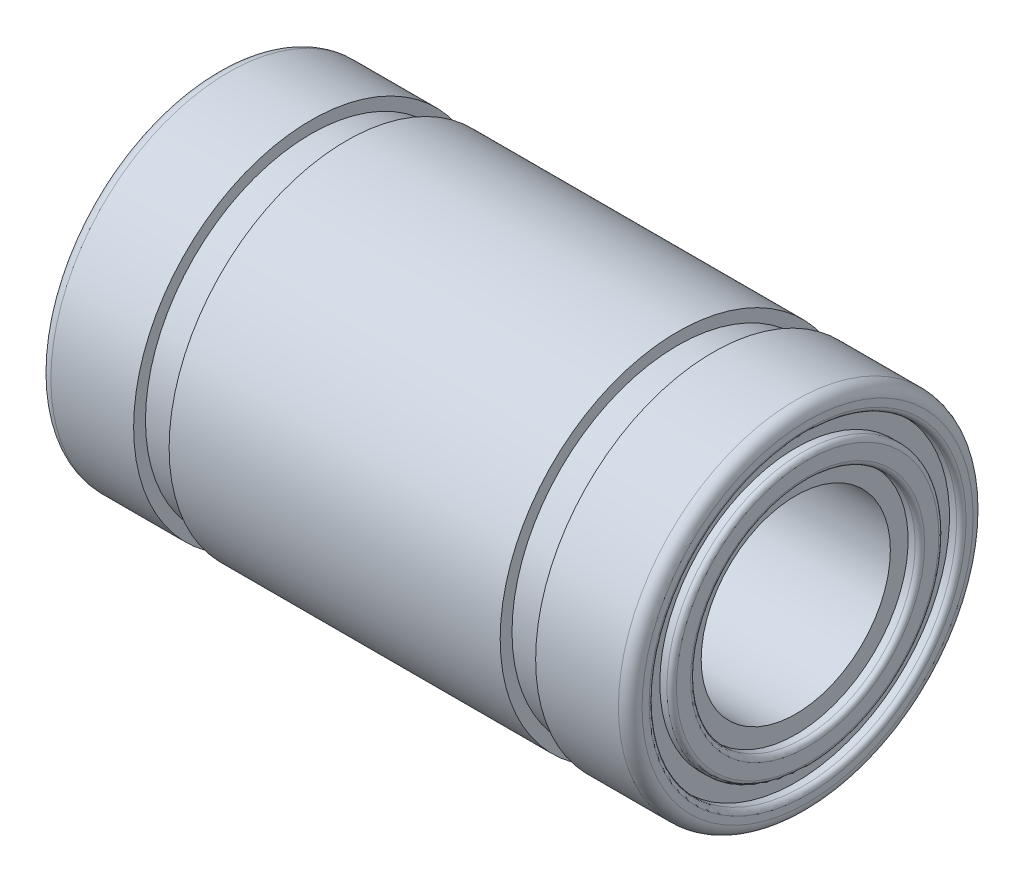
ISO-10303-21;
HEADER;
FILE_DESCRIPTION(('STEP AP214'),'2;1');
FILE_NAME('part.step','',(''),(''),'','','');
FILE_SCHEMA(('AUTOMOTIVE_DESIGN { 1 0 10303 214 1 1 1 1 }'));
ENDSEC;
DATA;
#1=APPLICATION_CONTEXT('core data for automotive mechanical design processes');
#2=APPLICATION_PROTOCOL_DEFINITION('international standard','automotive_design',2000,#1);
#3=PRODUCT_CONTEXT('',#1,'mechanical');
#4=PRODUCT('Part','Part','',(#3));
#5=PRODUCT_RELATED_PRODUCT_CATEGORY('part','',(#4));
#6=PRODUCT_DEFINITION_FORMATION('','',#4);
#7=PRODUCT_DEFINITION_CONTEXT('part definition',#1,'design');
#8=PRODUCT_DEFINITION('design','',#6,#7);
#9=PRODUCT_DEFINITION_SHAPE('','',#8);
#10=(LENGTH_UNIT() NAMED_UNIT(*) SI_UNIT(.MILLI.,.METRE.));
#11=(NAMED_UNIT(*) PLANE_ANGLE_UNIT() SI_UNIT($,.RADIAN.));
#12=(NAMED_UNIT(*) SI_UNIT($,.STERADIAN.) SOLID_ANGLE_UNIT());
#13=UNCERTAINTY_MEASURE_WITH_UNIT(LENGTH_MEASURE(1.E-05),#10,'distance_accuracy_value','');
#14=(GEOMETRIC_REPRESENTATION_CONTEXT(3) GLOBAL_UNCERTAINTY_ASSIGNED_CONTEXT((#13)) GLOBAL_UNIT_ASSIGNED_CONTEXT((#10,
#11,#12)) REPRESENTATION_CONTEXT('',''));
#15=CARTESIAN_POINT('',(0.,0.,0.));
#16=DIRECTION('',(0.,0.,1.));
#17=DIRECTION('',(1.,0.,0.));
#18=AXIS2_PLACEMENT_3D('',#15,#16,#17);
#19=CARTESIAN_POINT('',(24.5,4.75,0.));
#20=DIRECTION('',(-1.,0.,0.));
#21=DIRECTION('',(0.,0.,1.));
#22=AXIS2_PLACEMENT_3D('',#19,#20,#21);
#23=PLANE('',#22);
#24=CARTESIAN_POINT('',(24.5,0.,0.));
#25=DIRECTION('',(-1.,0.,0.));
#26=DIRECTION('',(0.,0.,1.));
#27=AXIS2_PLACEMENT_3D('',#24,#25,#26);
#28=CIRCLE('',#27,4.75);
#29=CARTESIAN_POINT('',(24.5,0.,4.75));
#30=VERTEX_POINT('',#29);
#31=EDGE_CURVE('E87',#30,#30,#28,.T.);
#32=ORIENTED_EDGE('',*,*,#31,.F.);
#33=EDGE_LOOP('',(#32));
#34=FACE_BOUND('',#33,.T.);
#35=CARTESIAN_POINT('',(24.5,0.,0.));
#36=DIRECTION('',(-1.,0.,0.));
#37=DIRECTION('',(0.,0.,1.));
#38=AXIS2_PLACEMENT_3D('',#35,#36,#37);
#39=CIRCLE('',#38,4.);
#40=CARTESIAN_POINT('',(24.5,0.,4.));
#41=VERTEX_POINT('',#40);
#42=EDGE_CURVE('E129',#41,#41,#39,.T.);
#43=ORIENTED_EDGE('',*,*,#42,.T.);
#44=EDGE_LOOP('',(#43));
#45=FACE_BOUND('',#44,.T.);
#46=ADVANCED_FACE('F31',(#34,#45),#23,.F.);
#47=CARTESIAN_POINT('',(0.,0.,0.));
#48=DIRECTION('',(-1.,0.,0.));
#49=DIRECTION('',(0.,0.,1.));
#50=AXIS2_PLACEMENT_3D('',#47,#48,#49);
#51=CYLINDRICAL_SURFACE('',#50,4.75);
#52=CARTESIAN_POINT('',(24.8,0.,0.));
#53=DIRECTION('',(-1.,0.,0.));
#54=DIRECTION('',(0.,0.,1.));
#55=AXIS2_PLACEMENT_3D('',#52,#53,#54);
#56=CIRCLE('',#55,4.75);
#57=CARTESIAN_POINT('',(24.8,0.,4.75));
#58=VERTEX_POINT('',#57);
#59=EDGE_CURVE('E54',#58,#58,#56,.F.);
#60=ORIENTED_EDGE('',*,*,#59,.T.);
#61=EDGE_LOOP('',(#60));
#62=FACE_BOUND('',#61,.T.);
#63=ORIENTED_EDGE('',*,*,#31,.T.);
#64=EDGE_LOOP('',(#63));
#65=FACE_BOUND('',#64,.T.);
#66=ADVANCED_FACE('F147',(#62,#65),#51,.F.);
#67=CARTESIAN_POINT('',(25.,4.75,0.));
#68=DIRECTION('',(-1.,0.,0.));
#69=DIRECTION('',(0.,0.,1.));
#70=AXIS2_PLACEMENT_3D('',#67,#68,#69);
#71=PLANE('',#70);
#72=CARTESIAN_POINT('',(25.,0.,0.));
#73=DIRECTION('',(-1.,0.,0.));
#74=DIRECTION('',(0.,0.,1.));
#75=AXIS2_PLACEMENT_3D('',#72,#73,#74);
#76=CIRCLE('',#75,4.95);
#77=CARTESIAN_POINT('',(25.,0.,4.95));
#78=VERTEX_POINT('',#77);
#79=EDGE_CURVE('E57',#78,#78,#76,.T.);
#80=ORIENTED_EDGE('',*,*,#79,.T.);
#81=EDGE_LOOP('',(#80));
#82=FACE_BOUND('',#81,.T.);
#83=CARTESIAN_POINT('',(25.,0.,0.));
#84=DIRECTION('',(-1.,0.,0.));
#85=DIRECTION('',(0.,0.,1.));
#86=AXIS2_PLACEMENT_3D('',#83,#84,#85);
#87=CIRCLE('',#86,5.55);
#88=CARTESIAN_POINT('',(25.,0.,5.55));
#89=VERTEX_POINT('',#88);
#90=EDGE_CURVE('E60',#89,#89,#87,.F.);
#91=ORIENTED_EDGE('',*,*,#90,.T.);
#92=EDGE_LOOP('',(#91));
#93=FACE_BOUND('',#92,.T.);
#94=ADVANCED_FACE('F153',(#82,#93),#71,.F.);
#95=CARTESIAN_POINT('',(0.,0.,0.));
#96=DIRECTION('',(-1.,0.,0.));
#97=DIRECTION('',(0.,0.,1.));
#98=AXIS2_PLACEMENT_3D('',#95,#96,#97);
#99=CYLINDRICAL_SURFACE('',#98,5.75);
#100=CARTESIAN_POINT('',(24.8,0.,0.));
#101=DIRECTION('',(-1.,0.,0.));
#102=DIRECTION('',(0.,0.,1.));
#103=AXIS2_PLACEMENT_3D('',#100,#101,#102);
#104=CIRCLE('',#103,5.75);
#105=CARTESIAN_POINT('',(24.8,0.,5.75));
#106=VERTEX_POINT('',#105);
#107=EDGE_CURVE('E51',#106,#106,#104,.T.);
#108=ORIENTED_EDGE('',*,*,#107,.T.);
#109=EDGE_LOOP('',(#108));
#110=FACE_BOUND('',#109,.T.);
#111=CARTESIAN_POINT('',(24.5,0.,0.));
#112=DIRECTION('',(-1.,0.,0.));
#113=DIRECTION('',(0.,0.,1.));
#114=AXIS2_PLACEMENT_3D('',#111,#112,#113);
#115=CIRCLE('',#114,5.75);
#116=CARTESIAN_POINT('',(24.5,0.,5.75));
#117=VERTEX_POINT('',#116);
#118=EDGE_CURVE('E90',#117,#117,#115,.T.);
#119=ORIENTED_EDGE('',*,*,#118,.F.);
#120=EDGE_LOOP('',(#119));
#121=FACE_BOUND('',#120,.T.);
#122=ADVANCED_FACE('F266',(#110,#121),#99,.T.);
#123=CARTESIAN_POINT('',(24.5,6.5,0.));
#124=DIRECTION('',(-1.,0.,0.));
#125=DIRECTION('',(0.,0.,1.));
#126=AXIS2_PLACEMENT_3D('',#123,#124,#125);
#127=PLANE('',#126);
#128=CARTESIAN_POINT('',(24.5,0.,0.));
#129=DIRECTION('',(-1.,0.,0.));
#130=DIRECTION('',(0.,0.,1.));
#131=AXIS2_PLACEMENT_3D('',#128,#129,#130);
#132=CIRCLE('',#131,6.5);
#133=CARTESIAN_POINT('',(24.5,0.,6.5));
#134=VERTEX_POINT('',#133);
#135=EDGE_CURVE('E93',#134,#134,#132,.T.);
#136=ORIENTED_EDGE('',*,*,#135,.F.);
#137=EDGE_LOOP('',(#136));
#138=FACE_BOUND('',#137,.T.);
#139=ORIENTED_EDGE('',*,*,#118,.T.);
#140=EDGE_LOOP('',(#139));
#141=FACE_BOUND('',#140,.T.);
#142=ADVANCED_FACE('F262',(#138,#141),#127,.F.);
#143=CARTESIAN_POINT('',(0.,0.,0.));
#144=DIRECTION('',(-1.,0.,0.));
#145=DIRECTION('',(0.,0.,1.));
#146=AXIS2_PLACEMENT_3D('',#143,#144,#145);
#147=CYLINDRICAL_SURFACE('',#146,6.5);
#148=CARTESIAN_POINT('',(24.8,0.,0.));
#149=DIRECTION('',(-1.,0.,0.));
#150=DIRECTION('',(0.,0.,1.));
#151=AXIS2_PLACEMENT_3D('',#148,#149,#150);
#152=CIRCLE('',#151,6.5);
#153=CARTESIAN_POINT('',(24.8,0.,6.5));
#154=VERTEX_POINT('',#153);
#155=EDGE_CURVE('E63',#154,#154,#152,.F.);
#156=ORIENTED_EDGE('',*,*,#155,.T.);
#157=EDGE_LOOP('',(#156));
#158=FACE_BOUND('',#157,.T.);
#159=ORIENTED_EDGE('',*,*,#135,.T.);
#160=EDGE_LOOP('',(#159));
#161=FACE_BOUND('',#160,.T.);
#162=ADVANCED_FACE('F258',(#158,#161),#147,.F.);
#163=CARTESIAN_POINT('',(25.,6.5,0.));
#164=DIRECTION('',(-1.,0.,0.));
#165=DIRECTION('',(0.,0.,1.));
#166=AXIS2_PLACEMENT_3D('',#163,#164,#165);
#167=PLANE('',#166);
#168=CARTESIAN_POINT('',(25.,0.,0.));
#169=DIRECTION('',(-1.,0.,0.));
#170=DIRECTION('',(0.,0.,1.));
#171=AXIS2_PLACEMENT_3D('',#168,#169,#170);
#172=CIRCLE('',#171,6.7);
#173=CARTESIAN_POINT('',(25.,0.,6.7));
#174=VERTEX_POINT('',#173);
#175=EDGE_CURVE('E66',#174,#174,#172,.T.);
#176=ORIENTED_EDGE('',*,*,#175,.T.);
#177=EDGE_LOOP('',(#176));
#178=FACE_BOUND('',#177,.T.);
#179=CARTESIAN_POINT('',(25.,0.,0.));
#180=DIRECTION('',(-1.,0.,0.));
#181=DIRECTION('',(0.,0.,1.));
#182=AXIS2_PLACEMENT_3D('',#179,#180,#181);
#183=CIRCLE('',#182,7.);
#184=CARTESIAN_POINT('',(25.,0.,7.));
#185=VERTEX_POINT('',#184);
#186=EDGE_CURVE('E81',#185,#185,#183,.F.);
#187=ORIENTED_EDGE('',*,*,#186,.T.);
#188=EDGE_LOOP('',(#187));
#189=FACE_BOUND('',#188,.T.);
#190=ADVANCED_FACE('F254',(#178,#189),#167,.F.);
#191=CARTESIAN_POINT('',(0.,0.,0.));
#192=DIRECTION('',(-1.,0.,0.));
#193=DIRECTION('',(0.,0.,1.));
#194=AXIS2_PLACEMENT_3D('',#191,#192,#193);
#195=CYLINDRICAL_SURFACE('',#194,7.5);
#196=CARTESIAN_POINT('',(24.5,0.,0.));
#197=DIRECTION('',(-1.,0.,0.));
#198=DIRECTION('',(0.,0.,1.));
#199=AXIS2_PLACEMENT_3D('',#196,#197,#198);
#200=CIRCLE('',#199,7.5);
#201=CARTESIAN_POINT('',(24.5,0.,7.5));
#202=VERTEX_POINT('',#201);
#203=EDGE_CURVE('E84',#202,#202,#200,.T.);
#204=ORIENTED_EDGE('',*,*,#203,.T.);
#205=EDGE_LOOP('',(#204));
#206=FACE_BOUND('',#205,.T.);
#207=CARTESIAN_POINT('',(21.,0.,0.));
#208=DIRECTION('',(-1.,0.,0.));
#209=DIRECTION('',(0.,0.,1.));
#210=AXIS2_PLACEMENT_3D('',#207,#208,#209);
#211=CIRCLE('',#210,7.5);
#212=CARTESIAN_POINT('',(21.,0.,7.5));
#213=VERTEX_POINT('',#212);
#214=EDGE_CURVE('E96',#213,#213,#211,.T.);
#215=ORIENTED_EDGE('',*,*,#214,.F.);
#216=EDGE_LOOP('',(#215));
#217=FACE_BOUND('',#216,.T.);
#218=ADVANCED_FACE('F250',(#206,#217),#195,.T.);
#219=CARTESIAN_POINT('',(21.,7.5,0.));
#220=DIRECTION('',(1.,0.,0.));
#221=DIRECTION('',(0.,0.,-1.));
#222=AXIS2_PLACEMENT_3D('',#219,#220,#221);
#223=PLANE('',#222);
#224=CARTESIAN_POINT('',(21.,0.,0.));
#225=DIRECTION('',(-1.,0.,0.));
#226=DIRECTION('',(0.,0.,1.));
#227=AXIS2_PLACEMENT_3D('',#224,#225,#226);
#228=CIRCLE('',#227,7.);
#229=CARTESIAN_POINT('',(21.,0.,7.));
#230=VERTEX_POINT('',#229);
#231=EDGE_CURVE('E99',#230,#230,#228,.T.);
#232=ORIENTED_EDGE('',*,*,#231,.F.);
#233=EDGE_LOOP('',(#232));
#234=FACE_BOUND('',#233,.T.);
#235=ORIENTED_EDGE('',*,*,#214,.T.);
#236=EDGE_LOOP('',(#235));
#237=FACE_BOUND('',#236,.T.);
#238=ADVANCED_FACE('F246',(#234,#237),#223,.F.);
#239=CARTESIAN_POINT('',(0.,0.,0.));
#240=DIRECTION('',(-1.,0.,0.));
#241=DIRECTION('',(0.,0.,1.));
#242=AXIS2_PLACEMENT_3D('',#239,#240,#241);
#243=CYLINDRICAL_SURFACE('',#242,7.);
#244=CARTESIAN_POINT('',(19.5,0.,0.));
#245=DIRECTION('',(-1.,0.,0.));
#246=DIRECTION('',(0.,0.,1.));
#247=AXIS2_PLACEMENT_3D('',#244,#245,#246);
#248=CIRCLE('',#247,7.);
#249=CARTESIAN_POINT('',(19.5,0.,7.));
#250=VERTEX_POINT('',#249);
#251=EDGE_CURVE('E102',#250,#250,#248,.T.);
#252=ORIENTED_EDGE('',*,*,#251,.F.);
#253=EDGE_LOOP('',(#252));
#254=FACE_BOUND('',#253,.T.);
#255=ORIENTED_EDGE('',*,*,#231,.T.);
#256=EDGE_LOOP('',(#255));
#257=FACE_BOUND('',#256,.T.);
#258=ADVANCED_FACE('F242',(#254,#257),#243,.T.);
#259=CARTESIAN_POINT('',(19.5,7.,0.));
#260=DIRECTION('',(-1.,0.,0.));
#261=DIRECTION('',(0.,0.,1.));
#262=AXIS2_PLACEMENT_3D('',#259,#260,#261);
#263=PLANE('',#262);
#264=CARTESIAN_POINT('',(19.5,0.,0.));
#265=DIRECTION('',(-1.,0.,0.));
#266=DIRECTION('',(0.,0.,1.));
#267=AXIS2_PLACEMENT_3D('',#264,#265,#266);
#268=CIRCLE('',#267,7.5);
#269=CARTESIAN_POINT('',(19.5,0.,7.5));
#270=VERTEX_POINT('',#269);
#271=EDGE_CURVE('E105',#270,#270,#268,.T.);
#272=ORIENTED_EDGE('',*,*,#271,.F.);
#273=EDGE_LOOP('',(#272));
#274=FACE_BOUND('',#273,.T.);
#275=ORIENTED_EDGE('',*,*,#251,.T.);
#276=EDGE_LOOP('',(#275));
#277=FACE_BOUND('',#276,.T.);
#278=ADVANCED_FACE('F238',(#274,#277),#263,.F.);
#279=CARTESIAN_POINT('',(0.,0.,0.));
#280=DIRECTION('',(-1.,0.,0.));
#281=DIRECTION('',(0.,0.,1.));
#282=AXIS2_PLACEMENT_3D('',#279,#280,#281);
#283=CYLINDRICAL_SURFACE('',#282,7.5);
#284=CARTESIAN_POINT('',(5.5,0.,0.));
#285=DIRECTION('',(-1.,0.,0.));
#286=DIRECTION('',(0.,0.,1.));
#287=AXIS2_PLACEMENT_3D('',#284,#285,#286);
#288=CIRCLE('',#287,7.5);
#289=CARTESIAN_POINT('',(5.5,0.,7.5));
#290=VERTEX_POINT('',#289);
#291=EDGE_CURVE('E108',#290,#290,#288,.T.);
#292=ORIENTED_EDGE('',*,*,#291,.F.);
#293=EDGE_LOOP('',(#292));
#294=FACE_BOUND('',#293,.T.);
#295=ORIENTED_EDGE('',*,*,#271,.T.);
#296=EDGE_LOOP('',(#295));
#297=FACE_BOUND('',#296,.T.);
#298=ADVANCED_FACE('F234',(#294,#297),#283,.T.);
#299=CARTESIAN_POINT('',(5.5,7.,0.));
#300=DIRECTION('',(1.,0.,0.));
#301=DIRECTION('',(0.,0.,-1.));
#302=AXIS2_PLACEMENT_3D('',#299,#300,#301);
#303=PLANE('',#302);
#304=CARTESIAN_POINT('',(5.5,0.,0.));
#305=DIRECTION('',(-1.,0.,0.));
#306=DIRECTION('',(0.,0.,1.));
#307=AXIS2_PLACEMENT_3D('',#304,#305,#306);
#308=CIRCLE('',#307,7.);
#309=CARTESIAN_POINT('',(5.5,0.,7.));
#310=VERTEX_POINT('',#309);
#311=EDGE_CURVE('E111',#310,#310,#308,.T.);
#312=ORIENTED_EDGE('',*,*,#311,.F.);
#313=EDGE_LOOP('',(#312));
#314=FACE_BOUND('',#313,.T.);
#315=ORIENTED_EDGE('',*,*,#291,.T.);
#316=EDGE_LOOP('',(#315));
#317=FACE_BOUND('',#316,.T.);
#318=ADVANCED_FACE('F230',(#314,#317),#303,.F.);
#319=CARTESIAN_POINT('',(0.,0.,0.));
#320=DIRECTION('',(-1.,0.,0.));
#321=DIRECTION('',(0.,0.,1.));
#322=AXIS2_PLACEMENT_3D('',#319,#320,#321);
#323=CYLINDRICAL_SURFACE('',#322,7.);
#324=CARTESIAN_POINT('',(4.,0.,0.));
#325=DIRECTION('',(-1.,0.,0.));
#326=DIRECTION('',(0.,0.,1.));
#327=AXIS2_PLACEMENT_3D('',#324,#325,#326);
#328=CIRCLE('',#327,7.);
#329=CARTESIAN_POINT('',(4.,0.,7.));
#330=VERTEX_POINT('',#329);
#331=EDGE_CURVE('E114',#330,#330,#328,.T.);
#332=ORIENTED_EDGE('',*,*,#331,.F.);
#333=EDGE_LOOP('',(#332));
#334=FACE_BOUND('',#333,.T.);
#335=ORIENTED_EDGE('',*,*,#311,.T.);
#336=EDGE_LOOP('',(#335));
#337=FACE_BOUND('',#336,.T.);
#338=ADVANCED_FACE('F226',(#334,#337),#323,.T.);
#339=CARTESIAN_POINT('',(4.,7.5,0.));
#340=DIRECTION('',(-1.,0.,0.));
#341=DIRECTION('',(0.,0.,1.));
#342=AXIS2_PLACEMENT_3D('',#339,#340,#341);
#343=PLANE('',#342);
#344=CARTESIAN_POINT('',(4.,0.,0.));
#345=DIRECTION('',(-1.,0.,0.));
#346=DIRECTION('',(0.,0.,1.));
#347=AXIS2_PLACEMENT_3D('',#344,#345,#346);
#348=CIRCLE('',#347,7.5);
#349=CARTESIAN_POINT('',(4.,0.,7.5));
#350=VERTEX_POINT('',#349);
#351=EDGE_CURVE('E117',#350,#350,#348,.T.);
#352=ORIENTED_EDGE('',*,*,#351,.F.);
#353=EDGE_LOOP('',(#352));
#354=FACE_BOUND('',#353,.T.);
#355=ORIENTED_EDGE('',*,*,#331,.T.);
#356=EDGE_LOOP('',(#355));
#357=FACE_BOUND('',#356,.T.);
#358=ADVANCED_FACE('F222',(#354,#357),#343,.F.);
#359=CARTESIAN_POINT('',(0.,0.,0.));
#360=DIRECTION('',(-1.,0.,0.));
#361=DIRECTION('',(0.,0.,1.));
#362=AXIS2_PLACEMENT_3D('',#359,#360,#361);
#363=CYLINDRICAL_SURFACE('',#362,7.5);
#364=CARTESIAN_POINT('',(0.499999999999995,0.,0.));
#365=DIRECTION('',(1.,0.,0.));
#366=DIRECTION('',(0.,0.,-1.));
#367=AXIS2_PLACEMENT_3D('',#364,#365,#366);
#368=CIRCLE('',#367,7.5);
#369=CARTESIAN_POINT('',(0.499999999999995,0.,-7.5));
#370=VERTEX_POINT('',#369);
#371=EDGE_CURVE('E75',#370,#370,#368,.T.);
#372=ORIENTED_EDGE('',*,*,#371,.T.);
#373=EDGE_LOOP('',(#372));
#374=FACE_BOUND('',#373,.T.);
#375=ORIENTED_EDGE('',*,*,#351,.T.);
#376=EDGE_LOOP('',(#375));
#377=FACE_BOUND('',#376,.T.);
#378=ADVANCED_FACE('F218',(#374,#377),#363,.T.);
#379=CARTESIAN_POINT('',(0.,6.49999999999999,0.));
#380=DIRECTION('',(1.,0.,0.));
#381=DIRECTION('',(0.,0.,-1.));
#382=AXIS2_PLACEMENT_3D('',#379,#380,#381);
#383=PLANE('',#382);
#384=CARTESIAN_POINT('',(0.,0.,0.));
#385=DIRECTION('',(1.,0.,0.));
#386=DIRECTION('',(0.,0.,-1.));
#387=AXIS2_PLACEMENT_3D('',#384,#385,#386);
#388=CIRCLE('',#387,6.69999999999999);
#389=CARTESIAN_POINT('',(0.,0.,-6.69999999999999));
#390=VERTEX_POINT('',#389);
#391=EDGE_CURVE('E69',#390,#390,#388,.T.);
#392=ORIENTED_EDGE('',*,*,#391,.T.);
#393=EDGE_LOOP('',(#392));
#394=FACE_BOUND('',#393,.T.);
#395=CARTESIAN_POINT('',(0.,0.,0.));
#396=DIRECTION('',(1.,0.,0.));
#397=DIRECTION('',(0.,0.,-1.));
#398=AXIS2_PLACEMENT_3D('',#395,#396,#397);
#399=CIRCLE('',#398,7.);
#400=CARTESIAN_POINT('',(0.,0.,-7.));
#401=VERTEX_POINT('',#400);
#402=EDGE_CURVE('E78',#401,#401,#399,.F.);
#403=ORIENTED_EDGE('',*,*,#402,.T.);
#404=EDGE_LOOP('',(#403));
#405=FACE_BOUND('',#404,.T.);
#406=ADVANCED_FACE('F214',(#394,#405),#383,.F.);
#407=CARTESIAN_POINT('',(0.,0.,0.));
#408=DIRECTION('',(-1.,0.,0.));
#409=DIRECTION('',(0.,0.,1.));
#410=AXIS2_PLACEMENT_3D('',#407,#408,#409);
#411=CYLINDRICAL_SURFACE('',#410,6.49999999999999);
#412=CARTESIAN_POINT('',(0.199999999999995,0.,0.));
#413=DIRECTION('',(1.,0.,0.));
#414=DIRECTION('',(0.,0.,-1.));
#415=AXIS2_PLACEMENT_3D('',#412,#413,#414);
#416=CIRCLE('',#415,6.49999999999999);
#417=CARTESIAN_POINT('',(0.199999999999995,0.,-6.49999999999999));
#418=VERTEX_POINT('',#417);
#419=EDGE_CURVE('E72',#418,#418,#416,.F.);
#420=ORIENTED_EDGE('',*,*,#419,.T.);
#421=EDGE_LOOP('',(#420));
#422=FACE_BOUND('',#421,.T.);
#423=CARTESIAN_POINT('',(0.499999999999994,0.,0.));
#424=DIRECTION('',(-1.,0.,0.));
#425=DIRECTION('',(0.,0.,1.));
#426=AXIS2_PLACEMENT_3D('',#423,#424,#425);
#427=CIRCLE('',#426,6.49999999999999);
#428=CARTESIAN_POINT('',(0.499999999999994,0.,6.49999999999999));
#429=VERTEX_POINT('',#428);
#430=EDGE_CURVE('E120',#429,#429,#427,.T.);
#431=ORIENTED_EDGE('',*,*,#430,.F.);
#432=EDGE_LOOP('',(#431));
#433=FACE_BOUND('',#432,.T.);
#434=ADVANCED_FACE('F210',(#422,#433),#411,.F.);
#435=CARTESIAN_POINT('',(0.499999999999995,6.49999999999999,0.));
#436=DIRECTION('',(1.,0.,0.));
#437=DIRECTION('',(0.,0.,-1.));
#438=AXIS2_PLACEMENT_3D('',#435,#436,#437);
#439=PLANE('',#438);
#440=CARTESIAN_POINT('',(0.499999999999997,0.,0.));
#441=DIRECTION('',(-1.,0.,0.));
#442=DIRECTION('',(0.,0.,1.));
#443=AXIS2_PLACEMENT_3D('',#440,#441,#442);
#444=CIRCLE('',#443,5.74999999999999);
#445=CARTESIAN_POINT('',(0.499999999999997,0.,5.74999999999999));
#446=VERTEX_POINT('',#445);
#447=EDGE_CURVE('E123',#446,#446,#444,.T.);
#448=ORIENTED_EDGE('',*,*,#447,.F.);
#449=EDGE_LOOP('',(#448));
#450=FACE_BOUND('',#449,.T.);
#451=ORIENTED_EDGE('',*,*,#430,.T.);
#452=EDGE_LOOP('',(#451));
#453=FACE_BOUND('',#452,.T.);
#454=ADVANCED_FACE('F207',(#450,#453),#439,.F.);
#455=CARTESIAN_POINT('',(0.,0.,0.));
#456=DIRECTION('',(-1.,0.,0.));
#457=DIRECTION('',(0.,0.,1.));
#458=AXIS2_PLACEMENT_3D('',#455,#456,#457);
#459=CYLINDRICAL_SURFACE('',#458,5.74999999999999);
#460=CARTESIAN_POINT('',(0.199999999999998,0.,0.));
#461=DIRECTION('',(1.,0.,0.));
#462=DIRECTION('',(0.,0.,-1.));
#463=AXIS2_PLACEMENT_3D('',#460,#461,#462);
#464=CIRCLE('',#463,5.74999999999999);
#465=CARTESIAN_POINT('',(0.199999999999998,0.,-5.74999999999999));
#466=VERTEX_POINT('',#465);
#467=EDGE_CURVE('E10',#466,#466,#464,.T.);
#468=ORIENTED_EDGE('',*,*,#467,.T.);
#469=EDGE_LOOP('',(#468));
#470=FACE_BOUND('',#469,.T.);
#471=ORIENTED_EDGE('',*,*,#447,.T.);
#472=EDGE_LOOP('',(#471));
#473=FACE_BOUND('',#472,.T.);
#474=ADVANCED_FACE('F204',(#470,#473),#459,.T.);
#475=CARTESIAN_POINT('',(0.,4.74999999999999,0.));
#476=DIRECTION('',(1.,0.,0.));
#477=DIRECTION('',(0.,0.,-1.));
#478=AXIS2_PLACEMENT_3D('',#475,#476,#477);
#479=PLANE('',#478);
#480=CARTESIAN_POINT('',(0.,0.,0.));
#481=DIRECTION('',(1.,0.,0.));
#482=DIRECTION('',(0.,0.,-1.));
#483=AXIS2_PLACEMENT_3D('',#480,#481,#482);
#484=CIRCLE('',#483,4.94999999999999);
#485=CARTESIAN_POINT('',(0.,0.,-4.94999999999999));
#486=VERTEX_POINT('',#485);
#487=EDGE_CURVE('E38',#486,#486,#484,.T.);
#488=ORIENTED_EDGE('',*,*,#487,.T.);
#489=EDGE_LOOP('',(#488));
#490=FACE_BOUND('',#489,.T.);
#491=CARTESIAN_POINT('',(0.,0.,0.));
#492=DIRECTION('',(1.,0.,0.));
#493=DIRECTION('',(0.,0.,-1.));
#494=AXIS2_PLACEMENT_3D('',#491,#492,#493);
#495=CIRCLE('',#494,5.54999999999999);
#496=CARTESIAN_POINT('',(0.,0.,-5.54999999999999));
#497=VERTEX_POINT('',#496);
#498=EDGE_CURVE('E42',#497,#497,#495,.F.);
#499=ORIENTED_EDGE('',*,*,#498,.T.);
#500=EDGE_LOOP('',(#499));
#501=FACE_BOUND('',#500,.T.);
#502=ADVANCED_FACE('F194',(#490,#501),#479,.F.);
#503=CARTESIAN_POINT('',(0.,0.,0.));
#504=DIRECTION('',(-1.,0.,0.));
#505=DIRECTION('',(0.,0.,1.));
#506=AXIS2_PLACEMENT_3D('',#503,#504,#505);
#507=CYLINDRICAL_SURFACE('',#506,4.74999999999999);
#508=CARTESIAN_POINT('',(0.199999999999998,0.,0.));
#509=DIRECTION('',(1.,0.,0.));
#510=DIRECTION('',(0.,0.,-1.));
#511=AXIS2_PLACEMENT_3D('',#508,#509,#510);
#512=CIRCLE('',#511,4.74999999999999);
#513=CARTESIAN_POINT('',(0.199999999999998,0.,-4.74999999999999));
#514=VERTEX_POINT('',#513);
#515=EDGE_CURVE('E46',#514,#514,#512,.F.);
#516=ORIENTED_EDGE('',*,*,#515,.T.);
#517=EDGE_LOOP('',(#516));
#518=FACE_BOUND('',#517,.T.);
#519=CARTESIAN_POINT('',(0.500000000000004,0.,0.));
#520=DIRECTION('',(-1.,0.,0.));
#521=DIRECTION('',(0.,0.,1.));
#522=AXIS2_PLACEMENT_3D('',#519,#520,#521);
#523=CIRCLE('',#522,4.74999999999999);
#524=CARTESIAN_POINT('',(0.500000000000004,0.,4.74999999999999));
#525=VERTEX_POINT('',#524);
#526=EDGE_CURVE('E126',#525,#525,#523,.T.);
#527=ORIENTED_EDGE('',*,*,#526,.F.);
#528=EDGE_LOOP('',(#527));
#529=FACE_BOUND('',#528,.T.);
#530=ADVANCED_FACE('F191',(#518,#529),#507,.F.);
#531=CARTESIAN_POINT('',(0.500000000000004,4.74999999999999,0.));
#532=DIRECTION('',(1.,0.,0.));
#533=DIRECTION('',(0.,0.,-1.));
#534=AXIS2_PLACEMENT_3D('',#531,#532,#533);
#535=PLANE('',#534);
#536=CARTESIAN_POINT('',(0.500000000000004,0.,0.));
#537=DIRECTION('',(1.,0.,0.));
#538=DIRECTION('',(0.,0.,-1.));
#539=AXIS2_PLACEMENT_3D('',#536,#537,#538);
#540=CIRCLE('',#539,4.);
#541=CARTESIAN_POINT('',(0.500000000000004,0.,-4.));
#542=VERTEX_POINT('',#541);
#543=EDGE_CURVE('E132',#542,#542,#540,.T.);
#544=ORIENTED_EDGE('',*,*,#543,.T.);
#545=EDGE_LOOP('',(#544));
#546=FACE_BOUND('',#545,.T.);
#547=ORIENTED_EDGE('',*,*,#526,.T.);
#548=EDGE_LOOP('',(#547));
#549=FACE_BOUND('',#548,.T.);
#550=ADVANCED_FACE('F136',(#546,#549),#535,.F.);
#551=CARTESIAN_POINT('',(-27.,0.,0.));
#552=DIRECTION('',(1.,0.,0.));
#553=DIRECTION('',(0.,0.,-1.));
#554=AXIS2_PLACEMENT_3D('',#551,#552,#553);
#555=CYLINDRICAL_SURFACE('',#554,4.);
#556=ORIENTED_EDGE('',*,*,#543,.F.);
#557=EDGE_LOOP('',(#556));
#558=FACE_BOUND('',#557,.T.);
#559=ORIENTED_EDGE('',*,*,#42,.F.);
#560=EDGE_LOOP('',(#559));
#561=FACE_BOUND('',#560,.T.);
#562=ADVANCED_FACE('F139',(#558,#561),#555,.F.);
#563=CARTESIAN_POINT('',(24.5,0.,0.));
#564=DIRECTION('',(-1.,0.,0.));
#565=DIRECTION('',(0.,0.,1.));
#566=AXIS2_PLACEMENT_3D('',#563,#564,#565);
#567=TOROIDAL_SURFACE('',#566,7.,0.5);
#568=ORIENTED_EDGE('',*,*,#186,.F.);
#569=EDGE_LOOP('',(#568));
#570=FACE_BOUND('',#569,.T.);
#571=ORIENTED_EDGE('',*,*,#203,.F.);
#572=EDGE_LOOP('',(#571));
#573=FACE_BOUND('',#572,.T.);
#574=ADVANCED_FACE('F142',(#570,#573),#567,.T.);
#575=CARTESIAN_POINT('',(0.499999999999995,0.,0.));
#576=DIRECTION('',(1.,0.,0.));
#577=DIRECTION('',(0.,0.,-1.));
#578=AXIS2_PLACEMENT_3D('',#575,#576,#577);
#579=TOROIDAL_SURFACE('',#578,7.,0.5);
#580=ORIENTED_EDGE('',*,*,#371,.F.);
#581=EDGE_LOOP('',(#580));
#582=FACE_BOUND('',#581,.T.);
#583=ORIENTED_EDGE('',*,*,#402,.F.);
#584=EDGE_LOOP('',(#583));
#585=FACE_BOUND('',#584,.T.);
#586=ADVANCED_FACE('F161',(#582,#585),#579,.T.);
#587=CARTESIAN_POINT('',(0.199999999999995,0.,0.));
#588=DIRECTION('',(1.,0.,0.));
#589=DIRECTION('',(0.,0.,-1.));
#590=AXIS2_PLACEMENT_3D('',#587,#588,#589);
#591=TOROIDAL_SURFACE('',#590,6.69999999999999,0.2);
#592=ORIENTED_EDGE('',*,*,#391,.F.);
#593=EDGE_LOOP('',(#592));
#594=FACE_BOUND('',#593,.T.);
#595=ORIENTED_EDGE('',*,*,#419,.F.);
#596=EDGE_LOOP('',(#595));
#597=FACE_BOUND('',#596,.T.);
#598=ADVANCED_FACE('F165',(#594,#597),#591,.T.);
#599=CARTESIAN_POINT('',(24.8,0.,0.));
#600=DIRECTION('',(-1.,0.,0.));
#601=DIRECTION('',(0.,0.,1.));
#602=AXIS2_PLACEMENT_3D('',#599,#600,#601);
#603=TOROIDAL_SURFACE('',#602,6.7,0.2);
#604=ORIENTED_EDGE('',*,*,#155,.F.);
#605=EDGE_LOOP('',(#604));
#606=FACE_BOUND('',#605,.T.);
#607=ORIENTED_EDGE('',*,*,#175,.F.);
#608=EDGE_LOOP('',(#607));
#609=FACE_BOUND('',#608,.T.);
#610=ADVANCED_FACE('F169',(#606,#609),#603,.T.);
#611=CARTESIAN_POINT('',(24.8,0.,0.));
#612=DIRECTION('',(-1.,0.,0.));
#613=DIRECTION('',(0.,0.,1.));
#614=AXIS2_PLACEMENT_3D('',#611,#612,#613);
#615=TOROIDAL_SURFACE('',#614,4.95,0.2);
#616=ORIENTED_EDGE('',*,*,#59,.F.);
#617=EDGE_LOOP('',(#616));
#618=FACE_BOUND('',#617,.T.);
#619=ORIENTED_EDGE('',*,*,#79,.F.);
#620=EDGE_LOOP('',(#619));
#621=FACE_BOUND('',#620,.T.);
#622=ADVANCED_FACE('F173',(#618,#621),#615,.T.);
#623=CARTESIAN_POINT('',(24.8,0.,0.));
#624=DIRECTION('',(-1.,0.,0.));
#625=DIRECTION('',(0.,0.,1.));
#626=AXIS2_PLACEMENT_3D('',#623,#624,#625);
#627=TOROIDAL_SURFACE('',#626,5.55,0.2);
#628=ORIENTED_EDGE('',*,*,#90,.F.);
#629=EDGE_LOOP('',(#628));
#630=FACE_BOUND('',#629,.T.);
#631=ORIENTED_EDGE('',*,*,#107,.F.);
#632=EDGE_LOOP('',(#631));
#633=FACE_BOUND('',#632,.T.);
#634=ADVANCED_FACE('F177',(#630,#633),#627,.T.);
#635=CARTESIAN_POINT('',(0.199999999999998,0.,0.));
#636=DIRECTION('',(1.,0.,0.));
#637=DIRECTION('',(0.,0.,-1.));
#638=AXIS2_PLACEMENT_3D('',#635,#636,#637);
#639=TOROIDAL_SURFACE('',#638,4.94999999999999,0.2);
#640=ORIENTED_EDGE('',*,*,#487,.F.);
#641=EDGE_LOOP('',(#640));
#642=FACE_BOUND('',#641,.T.);
#643=ORIENTED_EDGE('',*,*,#515,.F.);
#644=EDGE_LOOP('',(#643));
#645=FACE_BOUND('',#644,.T.);
#646=ADVANCED_FACE('F180',(#642,#645),#639,.T.);
#647=CARTESIAN_POINT('',(0.199999999999998,0.,0.));
#648=DIRECTION('',(1.,0.,0.));
#649=DIRECTION('',(0.,0.,-1.));
#650=AXIS2_PLACEMENT_3D('',#647,#648,#649);
#651=TOROIDAL_SURFACE('',#650,5.54999999999999,0.2);
#652=ORIENTED_EDGE('',*,*,#467,.F.);
#653=EDGE_LOOP('',(#652));
#654=FACE_BOUND('',#653,.T.);
#655=ORIENTED_EDGE('',*,*,#498,.F.);
#656=EDGE_LOOP('',(#655));
#657=FACE_BOUND('',#656,.T.);
#658=ADVANCED_FACE('F33',(#654,#657),#651,.T.);
#659=CLOSED_SHELL('',(#46,#66,#94,#122,#142,#162,#190,#218,#238,#258,#278,#298,#318,#338,#358,
#378,#406,#434,#454,#474,#502,#530,#550,#562,#574,#586,#598,#610,#622,#634,#646,#658));
#660=MANIFOLD_SOLID_BREP('B2',#659);
#661=ADVANCED_BREP_SHAPE_REPRESENTATION('',(#18,#660),#14);
#662=SHAPE_DEFINITION_REPRESENTATION(#9,#661);
ENDSEC;
END-ISO-10303-21;
